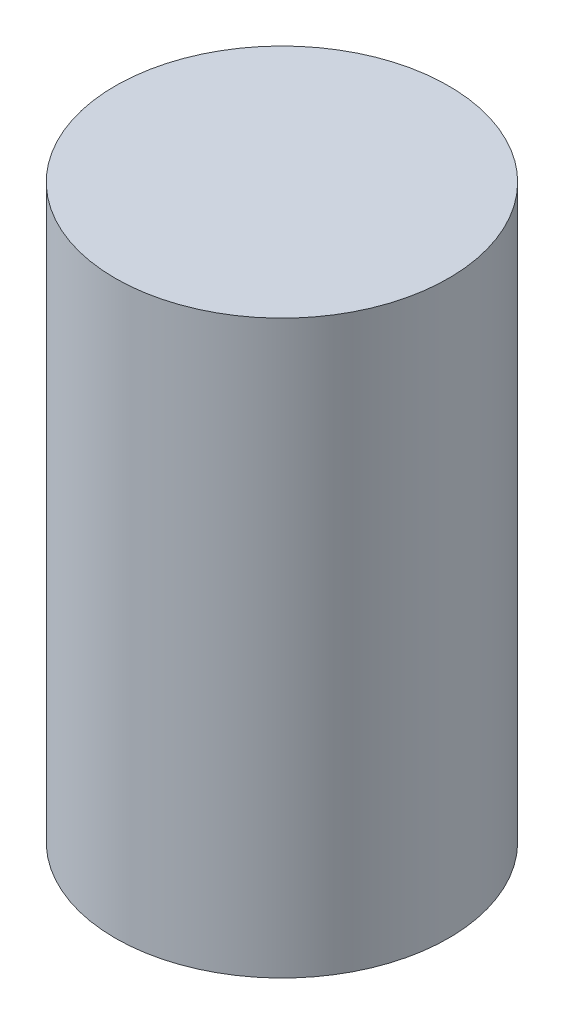
ISO-10303-21;
HEADER;
FILE_DESCRIPTION(('STEP AP214'),'2;1');
FILE_NAME('part.step','',(''),(''),'','','');
FILE_SCHEMA(('AUTOMOTIVE_DESIGN { 1 0 10303 214 1 1 1 1 }'));
ENDSEC;
DATA;
#1=APPLICATION_CONTEXT('core data for automotive mechanical design processes');
#2=APPLICATION_PROTOCOL_DEFINITION('international standard','automotive_design',2000,#1);
#3=PRODUCT_CONTEXT('',#1,'mechanical');
#4=PRODUCT('Part','Part','',(#3));
#5=PRODUCT_RELATED_PRODUCT_CATEGORY('part','',(#4));
#6=PRODUCT_DEFINITION_FORMATION('','',#4);
#7=PRODUCT_DEFINITION_CONTEXT('part definition',#1,'design');
#8=PRODUCT_DEFINITION('design','',#6,#7);
#9=PRODUCT_DEFINITION_SHAPE('','',#8);
#10=(LENGTH_UNIT() NAMED_UNIT(*) SI_UNIT(.MILLI.,.METRE.));
#11=(NAMED_UNIT(*) PLANE_ANGLE_UNIT() SI_UNIT($,.RADIAN.));
#12=(NAMED_UNIT(*) SI_UNIT($,.STERADIAN.) SOLID_ANGLE_UNIT());
#13=UNCERTAINTY_MEASURE_WITH_UNIT(LENGTH_MEASURE(1.E-05),#10,'distance_accuracy_value','');
#14=(GEOMETRIC_REPRESENTATION_CONTEXT(3) GLOBAL_UNCERTAINTY_ASSIGNED_CONTEXT((#13)) GLOBAL_UNIT_ASSIGNED_CONTEXT((#10,
#11,#12)) REPRESENTATION_CONTEXT('',''));
#15=CARTESIAN_POINT('',(0.,0.,0.));
#16=DIRECTION('',(0.,0.,1.));
#17=DIRECTION('',(1.,0.,0.));
#18=AXIS2_PLACEMENT_3D('',#15,#16,#17);
#19=CARTESIAN_POINT('',(0.,12000.,0.));
#20=DIRECTION('',(0.,-1.,0.));
#21=DIRECTION('',(0.,0.,-1.));
#22=AXIS2_PLACEMENT_3D('',#19,#20,#21);
#23=CYLINDRICAL_SURFACE('',#22,3500.);
#24=CARTESIAN_POINT('',(0.,12000.,0.));
#25=DIRECTION('',(0.,1.,0.));
#26=DIRECTION('',(0.,0.,1.));
#27=AXIS2_PLACEMENT_3D('',#24,#25,#26);
#28=CIRCLE('',#27,3500.);
#29=CARTESIAN_POINT('',(0.,12000.,3500.));
#30=VERTEX_POINT('',#29);
#31=EDGE_CURVE('E10',#30,#30,#28,.T.);
#32=ORIENTED_EDGE('',*,*,#31,.F.);
#33=EDGE_LOOP('',(#32));
#34=FACE_BOUND('',#33,.T.);
#35=CARTESIAN_POINT('',(0.,0.,0.));
#36=DIRECTION('',(0.,1.,0.));
#37=DIRECTION('',(0.,0.,1.));
#38=AXIS2_PLACEMENT_3D('',#35,#36,#37);
#39=CIRCLE('',#38,3500.);
#40=CARTESIAN_POINT('',(0.,0.,3500.));
#41=VERTEX_POINT('',#40);
#42=EDGE_CURVE('E38',#41,#41,#39,.T.);
#43=ORIENTED_EDGE('',*,*,#42,.T.);
#44=EDGE_LOOP('',(#43));
#45=FACE_BOUND('',#44,.T.);
#46=ADVANCED_FACE('F35',(#34,#45),#23,.T.);
#47=CARTESIAN_POINT('',(0.,12000.,0.));
#48=DIRECTION('',(0.,1.,0.));
#49=DIRECTION('',(0.,0.,1.));
#50=AXIS2_PLACEMENT_3D('',#47,#48,#49);
#51=PLANE('',#50);
#52=ORIENTED_EDGE('',*,*,#31,.T.);
#53=EDGE_LOOP('',(#52));
#54=FACE_BOUND('',#53,.T.);
#55=ADVANCED_FACE('F50',(#54),#51,.T.);
#56=CARTESIAN_POINT('',(0.,0.,0.));
#57=DIRECTION('',(0.,1.,0.));
#58=DIRECTION('',(0.,0.,1.));
#59=AXIS2_PLACEMENT_3D('',#56,#57,#58);
#60=PLANE('',#59);
#61=ORIENTED_EDGE('',*,*,#42,.F.);
#62=EDGE_LOOP('',(#61));
#63=FACE_BOUND('',#62,.T.);
#64=ADVANCED_FACE('F48',(#63),#60,.F.);
#65=CLOSED_SHELL('',(#46,#55,#64));
#66=MANIFOLD_SOLID_BREP('B2',#65);
#67=ADVANCED_BREP_SHAPE_REPRESENTATION('',(#18,#66),#14);
#68=SHAPE_DEFINITION_REPRESENTATION(#9,#67);
ENDSEC;
END-ISO-10303-21;
